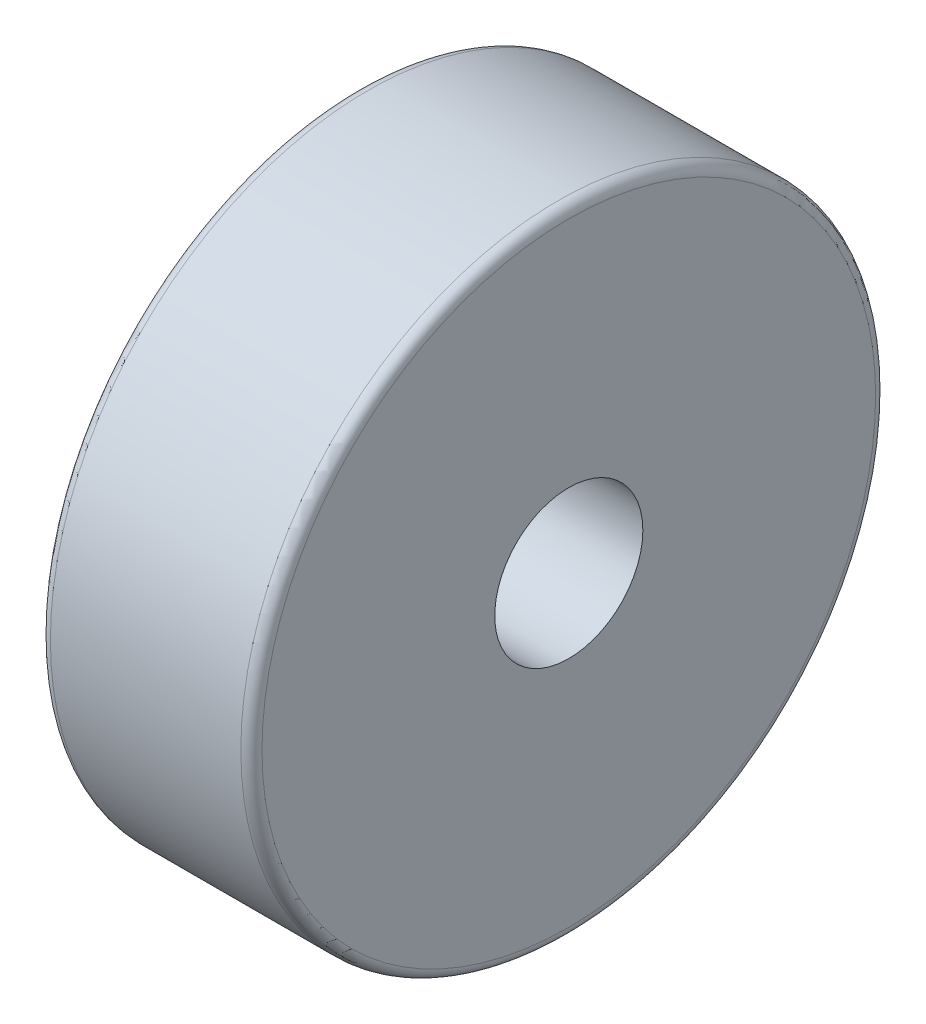
ISO-10303-21;
HEADER;
FILE_DESCRIPTION(('STEP AP214'),'2;1');
FILE_NAME('part.step','',(''),(''),'','','');
FILE_SCHEMA(('AUTOMOTIVE_DESIGN { 1 0 10303 214 1 1 1 1 }'));
ENDSEC;
DATA;
#1=APPLICATION_CONTEXT('core data for automotive mechanical design processes');
#2=APPLICATION_PROTOCOL_DEFINITION('international standard','automotive_design',2000,#1);
#3=PRODUCT_CONTEXT('',#1,'mechanical');
#4=PRODUCT('Part','Part','',(#3));
#5=PRODUCT_RELATED_PRODUCT_CATEGORY('part','',(#4));
#6=PRODUCT_DEFINITION_FORMATION('','',#4);
#7=PRODUCT_DEFINITION_CONTEXT('part definition',#1,'design');
#8=PRODUCT_DEFINITION('design','',#6,#7);
#9=PRODUCT_DEFINITION_SHAPE('','',#8);
#10=(LENGTH_UNIT() NAMED_UNIT(*) SI_UNIT(.MILLI.,.METRE.));
#11=(NAMED_UNIT(*) PLANE_ANGLE_UNIT() SI_UNIT($,.RADIAN.));
#12=(NAMED_UNIT(*) SI_UNIT($,.STERADIAN.) SOLID_ANGLE_UNIT());
#13=UNCERTAINTY_MEASURE_WITH_UNIT(LENGTH_MEASURE(1.E-05),#10,'distance_accuracy_value','');
#14=(GEOMETRIC_REPRESENTATION_CONTEXT(3) GLOBAL_UNCERTAINTY_ASSIGNED_CONTEXT((#13)) GLOBAL_UNIT_ASSIGNED_CONTEXT((#10,
#11,#12)) REPRESENTATION_CONTEXT('',''));
#15=CARTESIAN_POINT('',(0.,0.,0.));
#16=DIRECTION('',(0.,0.,1.));
#17=DIRECTION('',(1.,0.,0.));
#18=AXIS2_PLACEMENT_3D('',#15,#16,#17);
#19=CARTESIAN_POINT('',(0.,0.,0.));
#20=DIRECTION('',(1.,0.,0.));
#21=DIRECTION('',(0.,0.,-1.));
#22=AXIS2_PLACEMENT_3D('',#19,#20,#21);
#23=CYLINDRICAL_SURFACE('',#22,35.);
#24=CARTESIAN_POINT('',(100.,0.,0.));
#25=DIRECTION('',(1.,0.,0.));
#26=DIRECTION('',(0.,0.,-1.));
#27=AXIS2_PLACEMENT_3D('',#24,#25,#26);
#28=CIRCLE('',#27,35.);
#29=CARTESIAN_POINT('',(100.,0.,-35.));
#30=VERTEX_POINT('',#29);
#31=EDGE_CURVE('E140',#30,#30,#28,.T.);
#32=ORIENTED_EDGE('',*,*,#31,.T.);
#33=EDGE_LOOP('',(#32));
#34=FACE_BOUND('',#33,.T.);
#35=CARTESIAN_POINT('',(30.,0.,0.));
#36=DIRECTION('',(-1.,0.,0.));
#37=DIRECTION('',(0.,0.,1.));
#38=AXIS2_PLACEMENT_3D('',#35,#36,#37);
#39=CIRCLE('',#38,35.);
#40=CARTESIAN_POINT('',(30.,0.,35.));
#41=VERTEX_POINT('',#40);
#42=EDGE_CURVE('E11',#41,#41,#39,.T.);
#43=ORIENTED_EDGE('',*,*,#42,.T.);
#44=EDGE_LOOP('',(#43));
#45=FACE_BOUND('',#44,.T.);
#46=ADVANCED_FACE('F36',(#34,#45),#23,.F.);
#47=CARTESIAN_POINT('',(100.,0.,0.));
#48=DIRECTION('',(-1.,0.,0.));
#49=DIRECTION('',(0.,0.,1.));
#50=AXIS2_PLACEMENT_3D('',#47,#48,#49);
#51=CYLINDRICAL_SURFACE('',#50,150.);
#52=CARTESIAN_POINT('',(5.,0.,0.));
#53=DIRECTION('',(1.,0.,0.));
#54=DIRECTION('',(0.,0.,-1.));
#55=AXIS2_PLACEMENT_3D('',#52,#53,#54);
#56=CIRCLE('',#55,150.);
#57=CARTESIAN_POINT('',(5.,0.,150.));
#58=VERTEX_POINT('',#57);
#59=EDGE_CURVE('E171',#58,#58,#56,.T.);
#60=CARTESIAN_POINT('',(95.,0.,0.));
#61=DIRECTION('',(1.,0.,0.));
#62=DIRECTION('',(0.,0.,-1.));
#63=AXIS2_PLACEMENT_3D('',#60,#61,#62);
#64=CIRCLE('',#63,150.);
#65=CARTESIAN_POINT('',(95.,0.,150.));
#66=VERTEX_POINT('',#65);
#67=EDGE_CURVE('E167',#66,#66,#64,.F.);
#68=CARTESIAN_POINT('',(5.,0.,150.));
#69=CARTESIAN_POINT('',(5.9375,0.,150.));
#70=CARTESIAN_POINT('',(6.875,0.,150.));
#71=CARTESIAN_POINT('',(8.75,0.,150.));
#72=CARTESIAN_POINT('',(9.68750000000001,0.,150.));
#73=CARTESIAN_POINT('',(11.5625,0.,150.));
#74=CARTESIAN_POINT('',(12.5,0.,150.));
#75=CARTESIAN_POINT('',(14.375,0.,150.));
#76=CARTESIAN_POINT('',(15.3125,0.,150.));
#77=CARTESIAN_POINT('',(17.1875,0.,150.));
#78=CARTESIAN_POINT('',(18.125,0.,150.));
#79=CARTESIAN_POINT('',(20.,0.,150.));
#80=CARTESIAN_POINT('',(20.9375,0.,150.));
#81=CARTESIAN_POINT('',(22.8125,0.,150.));
#82=CARTESIAN_POINT('',(23.75,0.,150.));
#83=CARTESIAN_POINT('',(25.625,0.,150.));
#84=CARTESIAN_POINT('',(26.5625,0.,150.));
#85=CARTESIAN_POINT('',(28.4375,0.,150.));
#86=CARTESIAN_POINT('',(29.375,0.,150.));
#87=CARTESIAN_POINT('',(31.25,0.,150.));
#88=CARTESIAN_POINT('',(32.1875,0.,150.));
#89=CARTESIAN_POINT('',(34.0625,0.,150.));
#90=CARTESIAN_POINT('',(35.,0.,150.));
#91=CARTESIAN_POINT('',(36.875,0.,150.));
#92=CARTESIAN_POINT('',(37.8125,0.,150.));
#93=CARTESIAN_POINT('',(39.6875,0.,150.));
#94=CARTESIAN_POINT('',(40.625,0.,150.));
#95=CARTESIAN_POINT('',(42.5,0.,150.));
#96=CARTESIAN_POINT('',(43.4375,0.,150.));
#97=CARTESIAN_POINT('',(45.3125,0.,150.));
#98=CARTESIAN_POINT('',(46.25,0.,150.));
#99=CARTESIAN_POINT('',(48.125,0.,150.));
#100=CARTESIAN_POINT('',(49.0625,0.,150.));
#101=CARTESIAN_POINT('',(50.9375,0.,150.));
#102=CARTESIAN_POINT('',(51.875,0.,150.));
#103=CARTESIAN_POINT('',(53.75,0.,150.));
#104=CARTESIAN_POINT('',(54.6875,0.,150.));
#105=CARTESIAN_POINT('',(56.5625,0.,150.));
#106=CARTESIAN_POINT('',(57.5,0.,150.));
#107=CARTESIAN_POINT('',(59.375,0.,150.));
#108=CARTESIAN_POINT('',(60.3125,0.,150.));
#109=CARTESIAN_POINT('',(62.1875,0.,150.));
#110=CARTESIAN_POINT('',(63.125,0.,150.));
#111=CARTESIAN_POINT('',(65.,0.,150.));
#112=CARTESIAN_POINT('',(65.9375,0.,150.));
#113=CARTESIAN_POINT('',(67.8125,0.,150.));
#114=CARTESIAN_POINT('',(68.75,0.,150.));
#115=CARTESIAN_POINT('',(70.625,0.,150.));
#116=CARTESIAN_POINT('',(71.5625,0.,150.));
#117=CARTESIAN_POINT('',(73.4375,0.,150.));
#118=CARTESIAN_POINT('',(74.375,0.,150.));
#119=CARTESIAN_POINT('',(76.25,0.,150.));
#120=CARTESIAN_POINT('',(77.1875,0.,150.));
#121=CARTESIAN_POINT('',(79.0625,0.,150.));
#122=CARTESIAN_POINT('',(80.,0.,150.));
#123=CARTESIAN_POINT('',(81.875,0.,150.));
#124=CARTESIAN_POINT('',(82.8125,0.,150.));
#125=CARTESIAN_POINT('',(84.6875,0.,150.));
#126=CARTESIAN_POINT('',(85.625,0.,150.));
#127=CARTESIAN_POINT('',(87.5,0.,150.));
#128=CARTESIAN_POINT('',(88.4375,0.,150.));
#129=CARTESIAN_POINT('',(90.3125,0.,150.));
#130=CARTESIAN_POINT('',(91.25,0.,150.));
#131=CARTESIAN_POINT('',(93.125,0.,150.));
#132=CARTESIAN_POINT('',(94.0625,0.,150.));
#133=CARTESIAN_POINT('',(95.,0.,150.));
#134=B_SPLINE_CURVE_WITH_KNOTS('',3,(#68,#69,#70,#71,#72,#73,#74,#75,#76,#77,#78,#79,#80,#81,
#82,#83,#84,#85,#86,#87,#88,#89,#90,#91,#92,#93,#94,#95,#96,#97,#98,#99,#100,#101,#102,#103,
#104,#105,#106,#107,#108,#109,#110,#111,#112,#113,#114,#115,#116,#117,#118,#119,#120,#121,#122,
#123,#124,#125,#126,#127,#128,#129,#130,#131,#132,#133),.UNSPECIFIED.,.F.,.F.,(4,2,2,2,2,2,2,2,
2,2,2,2,2,2,2,2,2,2,2,2,2,2,2,2,2,2,2,2,2,2,2,2,4),(0.,2.8125,5.62500000000001,8.4375,11.25,
14.0625,16.875,19.6875,22.5,25.3125,28.125,30.9375,33.75,36.5625,39.375,42.1875,45.,47.8125,
50.625,53.4375,56.25,59.0625,61.875,64.6875,67.5,70.3125,73.125,75.9375,78.75,81.5625,84.375,
87.1875,90.),.UNSPECIFIED.);
#135=EDGE_CURVE('BSEAM196',#58,#66,#134,.T.);
#136=ORIENTED_EDGE('',*,*,#59,.T.);
#137=ORIENTED_EDGE('',*,*,#67,.T.);
#138=ORIENTED_EDGE('',*,*,#135,.T.);
#139=ORIENTED_EDGE('',*,*,#135,.F.);
#140=EDGE_LOOP('',(#136,#138,#137,#139));
#141=FACE_BOUND('',#140,.T.);
#142=ADVANCED_FACE('F196',(#141),#51,.T.);
#143=CARTESIAN_POINT('',(100.,0.,0.));
#144=DIRECTION('',(1.,0.,0.));
#145=DIRECTION('',(0.,0.,-1.));
#146=AXIS2_PLACEMENT_3D('',#143,#144,#145);
#147=PLANE('',#146);
#148=CARTESIAN_POINT('',(100.,0.,0.));
#149=DIRECTION('',(1.,0.,0.));
#150=DIRECTION('',(0.,0.,-1.));
#151=AXIS2_PLACEMENT_3D('',#148,#149,#150);
#152=CIRCLE('',#151,145.);
#153=CARTESIAN_POINT('',(100.,0.,-145.));
#154=VERTEX_POINT('',#153);
#155=EDGE_CURVE('E45',#154,#154,#152,.T.);
#156=ORIENTED_EDGE('',*,*,#155,.T.);
#157=EDGE_LOOP('',(#156));
#158=FACE_BOUND('',#157,.T.);
#159=ORIENTED_EDGE('',*,*,#31,.F.);
#160=EDGE_LOOP('',(#159));
#161=FACE_BOUND('',#160,.T.);
#162=ADVANCED_FACE('F179',(#158,#161),#147,.T.);
#163=CARTESIAN_POINT('',(0.,0.,0.));
#164=DIRECTION('',(1.,0.,0.));
#165=DIRECTION('',(0.,0.,-1.));
#166=AXIS2_PLACEMENT_3D('',#163,#164,#165);
#167=PLANE('',#166);
#168=DIRECTION('',(0.,1.,0.));
#169=VECTOR('',#168,1.);
#170=CARTESIAN_POINT('',(0.,128.452325786651,-20.));
#171=LINE('',#170,#169);
#172=CARTESIAN_POINT('',(0.,45.8257569495584,-20.));
#173=VERTEX_POINT('',#172);
#174=CARTESIAN_POINT('',(0.,128.452325786651,-20.));
#175=VERTEX_POINT('',#174);
#176=EDGE_CURVE('E65',#173,#175,#171,.T.);
#177=ORIENTED_EDGE('',*,*,#176,.F.);
#178=CARTESIAN_POINT('',(0.,0.,0.));
#179=DIRECTION('',(-1.,0.,0.));
#180=DIRECTION('',(0.,0.,1.));
#181=AXIS2_PLACEMENT_3D('',#178,#179,#180);
#182=CIRCLE('',#181,50.);
#183=CARTESIAN_POINT('',(0.,45.8257569495586,19.9999999999995));
#184=VERTEX_POINT('',#183);
#185=EDGE_CURVE('E139',#184,#173,#182,.T.);
#186=ORIENTED_EDGE('',*,*,#185,.F.);
#187=DIRECTION('',(0.,-1.,0.));
#188=VECTOR('',#187,1.);
#189=CARTESIAN_POINT('',(0.,128.452325786651,19.9999999999986));
#190=LINE('',#189,#188);
#191=CARTESIAN_POINT('',(0.,128.452325786651,19.9999999999987));
#192=VERTEX_POINT('',#191);
#193=EDGE_CURVE('E117',#192,#184,#190,.T.);
#194=ORIENTED_EDGE('',*,*,#193,.F.);
#195=CARTESIAN_POINT('',(0.,0.,0.));
#196=DIRECTION('',(-1.,0.,0.));
#197=DIRECTION('',(0.,-1.,0.));
#198=AXIS2_PLACEMENT_3D('',#195,#196,#197);
#199=CIRCLE('',#198,130.);
#200=CARTESIAN_POINT('',(0.,20.0000000000013,128.452325786651));
#201=VERTEX_POINT('',#200);
#202=EDGE_CURVE('E128',#201,#192,#199,.T.);
#203=ORIENTED_EDGE('',*,*,#202,.F.);
#204=DIRECTION('',(0.,0.,1.));
#205=VECTOR('',#204,1.);
#206=CARTESIAN_POINT('',(0.,20.0000000000013,128.452325786651));
#207=LINE('',#206,#205);
#208=CARTESIAN_POINT('',(0.,20.0000000000005,45.8257569495582));
#209=VERTEX_POINT('',#208);
#210=EDGE_CURVE('E133',#209,#201,#207,.T.);
#211=ORIENTED_EDGE('',*,*,#210,.F.);
#212=CARTESIAN_POINT('',(0.,-20.,45.8257569495584));
#213=VERTEX_POINT('',#212);
#214=EDGE_CURVE('E502',#213,#209,#182,.T.);
#215=ORIENTED_EDGE('',*,*,#214,.F.);
#216=DIRECTION('',(0.,0.,-1.));
#217=VECTOR('',#216,1.);
#218=CARTESIAN_POINT('',(0.,-20.,128.452325786651));
#219=LINE('',#218,#217);
#220=CARTESIAN_POINT('',(0.,-20.,128.452325786651));
#221=VERTEX_POINT('',#220);
#222=EDGE_CURVE('E123',#221,#213,#219,.T.);
#223=ORIENTED_EDGE('',*,*,#222,.F.);
#224=CARTESIAN_POINT('',(0.,0.,0.));
#225=DIRECTION('',(-1.,0.,0.));
#226=DIRECTION('',(0.,0.,-1.));
#227=AXIS2_PLACEMENT_3D('',#224,#225,#226);
#228=CIRCLE('',#227,130.);
#229=CARTESIAN_POINT('',(0.,-128.452325786651,20.));
#230=VERTEX_POINT('',#229);
#231=EDGE_CURVE('E449',#230,#221,#228,.T.);
#232=ORIENTED_EDGE('',*,*,#231,.F.);
#233=DIRECTION('',(0.,-1.,0.));
#234=VECTOR('',#233,1.);
#235=CARTESIAN_POINT('',(0.,-128.452325786651,20.));
#236=LINE('',#235,#234);
#237=CARTESIAN_POINT('',(0.,-45.8257569495584,20.));
#238=VERTEX_POINT('',#237);
#239=EDGE_CURVE('E457',#238,#230,#236,.T.);
#240=ORIENTED_EDGE('',*,*,#239,.F.);
#241=CARTESIAN_POINT('',(0.,-45.8257569495585,-19.9999999999998));
#242=VERTEX_POINT('',#241);
#243=EDGE_CURVE('E510',#242,#238,#182,.T.);
#244=ORIENTED_EDGE('',*,*,#243,.F.);
#245=DIRECTION('',(0.,1.,0.));
#246=VECTOR('',#245,1.);
#247=CARTESIAN_POINT('',(0.,-128.452325786651,-19.9999999999995));
#248=LINE('',#247,#246);
#249=CARTESIAN_POINT('',(0.,-128.452325786651,-19.9999999999996));
#250=VERTEX_POINT('',#249);
#251=EDGE_CURVE('E425',#250,#242,#248,.T.);
#252=ORIENTED_EDGE('',*,*,#251,.F.);
#253=CARTESIAN_POINT('',(0.,0.,0.));
#254=DIRECTION('',(-1.,0.,0.));
#255=DIRECTION('',(0.,1.,0.));
#256=AXIS2_PLACEMENT_3D('',#253,#254,#255);
#257=CIRCLE('',#256,130.);
#258=CARTESIAN_POINT('',(0.,-20.0000000000004,-128.452325786651));
#259=VERTEX_POINT('',#258);
#260=EDGE_CURVE('E430',#259,#250,#257,.T.);
#261=ORIENTED_EDGE('',*,*,#260,.F.);
#262=DIRECTION('',(0.,0.,-1.));
#263=VECTOR('',#262,1.);
#264=CARTESIAN_POINT('',(0.,-20.0000000000004,-128.452325786651));
#265=LINE('',#264,#263);
#266=CARTESIAN_POINT('',(0.,-20.0000000000001,-45.8257569495584));
#267=VERTEX_POINT('',#266);
#268=EDGE_CURVE('E433',#267,#259,#265,.T.);
#269=ORIENTED_EDGE('',*,*,#268,.F.);
#270=CARTESIAN_POINT('',(0.,20.,-45.8257569495584));
#271=VERTEX_POINT('',#270);
#272=EDGE_CURVE('E530',#271,#267,#182,.T.);
#273=ORIENTED_EDGE('',*,*,#272,.F.);
#274=DIRECTION('',(0.,0.,1.));
#275=VECTOR('',#274,1.);
#276=CARTESIAN_POINT('',(0.,20.,-128.452325786651));
#277=LINE('',#276,#275);
#278=CARTESIAN_POINT('',(0.,20.,-128.452325786651));
#279=VERTEX_POINT('',#278);
#280=EDGE_CURVE('E161',#279,#271,#277,.T.);
#281=ORIENTED_EDGE('',*,*,#280,.F.);
#282=CARTESIAN_POINT('',(0.,0.,0.));
#283=DIRECTION('',(-1.,0.,0.));
#284=DIRECTION('',(0.,0.,1.));
#285=AXIS2_PLACEMENT_3D('',#282,#283,#284);
#286=CIRCLE('',#285,130.);
#287=EDGE_CURVE('E155',#175,#279,#286,.T.);
#288=ORIENTED_EDGE('',*,*,#287,.F.);
#289=EDGE_LOOP('',(#177,#186,#194,#203,#211,#215,#223,#232,#240,#244,#252,#261,#269,#273,#281,#288));
#290=FACE_BOUND('',#289,.T.);
#291=CARTESIAN_POINT('',(0.,0.,0.));
#292=DIRECTION('',(1.,0.,0.));
#293=DIRECTION('',(0.,0.,-1.));
#294=AXIS2_PLACEMENT_3D('',#291,#292,#293);
#295=CIRCLE('',#294,145.);
#296=CARTESIAN_POINT('',(0.,0.,-145.));
#297=VERTEX_POINT('',#296);
#298=EDGE_CURVE('E174',#297,#297,#295,.F.);
#299=ORIENTED_EDGE('',*,*,#298,.T.);
#300=EDGE_LOOP('',(#299));
#301=FACE_BOUND('',#300,.T.);
#302=ADVANCED_FACE('F136',(#290,#301),#167,.F.);
#303=CARTESIAN_POINT('',(5.,0.,0.));
#304=DIRECTION('',(1.,0.,0.));
#305=DIRECTION('',(0.,0.,-1.));
#306=AXIS2_PLACEMENT_3D('',#303,#304,#305);
#307=TOROIDAL_SURFACE('',#306,145.,5.);
#308=ORIENTED_EDGE('',*,*,#298,.F.);
#309=EDGE_LOOP('',(#308));
#310=FACE_BOUND('',#309,.T.);
#311=ORIENTED_EDGE('',*,*,#59,.F.);
#312=EDGE_LOOP('',(#311));
#313=FACE_BOUND('',#312,.T.);
#314=ADVANCED_FACE('F184',(#310,#313),#307,.T.);
#315=CARTESIAN_POINT('',(95.,0.,0.));
#316=DIRECTION('',(1.,0.,0.));
#317=DIRECTION('',(0.,0.,-1.));
#318=AXIS2_PLACEMENT_3D('',#315,#316,#317);
#319=TOROIDAL_SURFACE('',#318,145.,5.);
#320=ORIENTED_EDGE('',*,*,#67,.F.);
#321=EDGE_LOOP('',(#320));
#322=FACE_BOUND('',#321,.T.);
#323=ORIENTED_EDGE('',*,*,#155,.F.);
#324=EDGE_LOOP('',(#323));
#325=FACE_BOUND('',#324,.T.);
#326=ADVANCED_FACE('F38',(#322,#325),#319,.T.);
#327=CARTESIAN_POINT('',(30.,20.,-128.452325786651));
#328=DIRECTION('',(0.,-1.,0.));
#329=DIRECTION('',(0.,0.,-1.));
#330=AXIS2_PLACEMENT_3D('',#327,#328,#329);
#331=PLANE('',#330);
#332=ORIENTED_EDGE('',*,*,#280,.T.);
#333=DIRECTION('',(-1.,0.,0.));
#334=VECTOR('',#333,1.);
#335=CARTESIAN_POINT('',(171.42135623731,20.,-45.8257569495584));
#336=LINE('',#335,#334);
#337=CARTESIAN_POINT('',(30.,20.,-45.8257569495584));
#338=VERTEX_POINT('',#337);
#339=EDGE_CURVE('E144',#271,#338,#336,.F.);
#340=ORIENTED_EDGE('',*,*,#339,.T.);
#341=DIRECTION('',(0.,0.,1.));
#342=VECTOR('',#341,1.);
#343=CARTESIAN_POINT('',(30.,20.,-128.452325786651));
#344=LINE('',#343,#342);
#345=CARTESIAN_POINT('',(30.,20.,-128.452325786651));
#346=VERTEX_POINT('',#345);
#347=EDGE_CURVE('E151',#346,#338,#344,.T.);
#348=ORIENTED_EDGE('',*,*,#347,.F.);
#349=DIRECTION('',(-1.,0.,0.));
#350=VECTOR('',#349,1.);
#351=CARTESIAN_POINT('',(30.,20.,-128.452325786651));
#352=LINE('',#351,#350);
#353=EDGE_CURVE('E53',#346,#279,#352,.T.);
#354=ORIENTED_EDGE('',*,*,#353,.T.);
#355=EDGE_LOOP('',(#332,#340,#348,#354));
#356=FACE_BOUND('',#355,.T.);
#357=ADVANCED_FACE('F183',(#356),#331,.F.);
#358=CARTESIAN_POINT('',(30.,0.,0.));
#359=DIRECTION('',(-1.,0.,0.));
#360=DIRECTION('',(0.,0.,1.));
#361=AXIS2_PLACEMENT_3D('',#358,#359,#360);
#362=CYLINDRICAL_SURFACE('',#361,130.);
#363=ORIENTED_EDGE('',*,*,#287,.T.);
#364=ORIENTED_EDGE('',*,*,#353,.F.);
#365=CARTESIAN_POINT('',(30.,0.,0.));
#366=DIRECTION('',(-1.,0.,0.));
#367=DIRECTION('',(0.,0.,1.));
#368=AXIS2_PLACEMENT_3D('',#365,#366,#367);
#369=CIRCLE('',#368,130.);
#370=CARTESIAN_POINT('',(30.,128.452325786651,-20.));
#371=VERTEX_POINT('',#370);
#372=EDGE_CURVE('E157',#371,#346,#369,.T.);
#373=ORIENTED_EDGE('',*,*,#372,.F.);
#374=DIRECTION('',(-1.,0.,0.));
#375=VECTOR('',#374,1.);
#376=CARTESIAN_POINT('',(30.,128.452325786651,-20.));
#377=LINE('',#376,#375);
#378=EDGE_CURVE('E160',#371,#175,#377,.T.);
#379=ORIENTED_EDGE('',*,*,#378,.T.);
#380=EDGE_LOOP('',(#363,#364,#373,#379));
#381=FACE_BOUND('',#380,.T.);
#382=ADVANCED_FACE('F190',(#381),#362,.F.);
#383=CARTESIAN_POINT('',(30.,128.452325786651,-20.));
#384=DIRECTION('',(0.,0.,1.));
#385=DIRECTION('',(1.,0.,0.));
#386=AXIS2_PLACEMENT_3D('',#383,#384,#385);
#387=PLANE('',#386);
#388=DIRECTION('',(0.,1.,0.));
#389=VECTOR('',#388,1.);
#390=CARTESIAN_POINT('',(30.,128.452325786651,-20.));
#391=LINE('',#390,#389);
#392=CARTESIAN_POINT('',(30.,45.8257569495584,-20.));
#393=VERTEX_POINT('',#392);
#394=EDGE_CURVE('E154',#393,#371,#391,.T.);
#395=ORIENTED_EDGE('',*,*,#394,.F.);
#396=DIRECTION('',(-1.,0.,0.));
#397=VECTOR('',#396,1.);
#398=CARTESIAN_POINT('',(171.42135623731,45.8257569495584,-20.));
#399=LINE('',#398,#397);
#400=EDGE_CURVE('E521',#393,#173,#399,.T.);
#401=ORIENTED_EDGE('',*,*,#400,.T.);
#402=ORIENTED_EDGE('',*,*,#176,.T.);
#403=ORIENTED_EDGE('',*,*,#378,.F.);
#404=EDGE_LOOP('',(#395,#401,#402,#403));
#405=FACE_BOUND('',#404,.T.);
#406=ADVANCED_FACE('F243',(#405),#387,.F.);
#407=CARTESIAN_POINT('',(30.,0.,0.));
#408=DIRECTION('',(-1.,0.,0.));
#409=DIRECTION('',(0.,0.,1.));
#410=AXIS2_PLACEMENT_3D('',#407,#408,#409);
#411=PLANE('',#410);
#412=ORIENTED_EDGE('',*,*,#347,.T.);
#413=CARTESIAN_POINT('',(30.,0.,0.));
#414=DIRECTION('',(-1.,0.,0.));
#415=DIRECTION('',(0.,0.,1.));
#416=AXIS2_PLACEMENT_3D('',#413,#414,#415);
#417=CIRCLE('',#416,50.);
#418=CARTESIAN_POINT('',(30.,-20.0000000000001,-45.8257569495584));
#419=VERTEX_POINT('',#418);
#420=EDGE_CURVE('E418',#419,#338,#417,.F.);
#421=ORIENTED_EDGE('',*,*,#420,.F.);
#422=DIRECTION('',(0.,0.,-1.));
#423=VECTOR('',#422,1.);
#424=CARTESIAN_POINT('',(30.,-20.0000000000004,-128.452325786651));
#425=LINE('',#424,#423);
#426=CARTESIAN_POINT('',(30.,-20.0000000000004,-128.452325786651));
#427=VERTEX_POINT('',#426);
#428=EDGE_CURVE('E429',#419,#427,#425,.T.);
#429=ORIENTED_EDGE('',*,*,#428,.T.);
#430=CARTESIAN_POINT('',(30.,0.,0.));
#431=DIRECTION('',(-1.,0.,0.));
#432=DIRECTION('',(0.,1.,0.));
#433=AXIS2_PLACEMENT_3D('',#430,#431,#432);
#434=CIRCLE('',#433,130.);
#435=CARTESIAN_POINT('',(30.,-128.452325786651,-19.9999999999996));
#436=VERTEX_POINT('',#435);
#437=EDGE_CURVE('E428',#427,#436,#434,.T.);
#438=ORIENTED_EDGE('',*,*,#437,.T.);
#439=DIRECTION('',(0.,1.,0.));
#440=VECTOR('',#439,1.);
#441=CARTESIAN_POINT('',(30.,-128.452325786651,-19.9999999999995));
#442=LINE('',#441,#440);
#443=CARTESIAN_POINT('',(30.,-45.8257569495585,-19.9999999999998));
#444=VERTEX_POINT('',#443);
#445=EDGE_CURVE('E422',#436,#444,#442,.T.);
#446=ORIENTED_EDGE('',*,*,#445,.T.);
#447=CARTESIAN_POINT('',(30.,-45.8257569495584,20.));
#448=VERTEX_POINT('',#447);
#449=EDGE_CURVE('E404',#448,#444,#417,.F.);
#450=ORIENTED_EDGE('',*,*,#449,.F.);
#451=DIRECTION('',(0.,-1.,0.));
#452=VECTOR('',#451,1.);
#453=CARTESIAN_POINT('',(30.,-128.452325786651,20.));
#454=LINE('',#453,#452);
#455=CARTESIAN_POINT('',(30.,-128.452325786651,20.));
#456=VERTEX_POINT('',#455);
#457=EDGE_CURVE('E448',#448,#456,#454,.T.);
#458=ORIENTED_EDGE('',*,*,#457,.T.);
#459=CARTESIAN_POINT('',(30.,0.,0.));
#460=DIRECTION('',(-1.,0.,0.));
#461=DIRECTION('',(0.,0.,-1.));
#462=AXIS2_PLACEMENT_3D('',#459,#460,#461);
#463=CIRCLE('',#462,130.);
#464=CARTESIAN_POINT('',(30.,-20.,128.452325786651));
#465=VERTEX_POINT('',#464);
#466=EDGE_CURVE('E451',#456,#465,#463,.T.);
#467=ORIENTED_EDGE('',*,*,#466,.T.);
#468=DIRECTION('',(0.,0.,-1.));
#469=VECTOR('',#468,1.);
#470=CARTESIAN_POINT('',(30.,-20.,128.452325786651));
#471=LINE('',#470,#469);
#472=CARTESIAN_POINT('',(30.,-20.,45.8257569495584));
#473=VERTEX_POINT('',#472);
#474=EDGE_CURVE('E445',#465,#473,#471,.T.);
#475=ORIENTED_EDGE('',*,*,#474,.T.);
#476=CARTESIAN_POINT('',(30.,20.0000000000005,45.8257569495582));
#477=VERTEX_POINT('',#476);
#478=EDGE_CURVE('E420',#477,#473,#417,.F.);
#479=ORIENTED_EDGE('',*,*,#478,.F.);
#480=DIRECTION('',(0.,0.,1.));
#481=VECTOR('',#480,1.);
#482=CARTESIAN_POINT('',(30.,20.0000000000013,128.452325786651));
#483=LINE('',#482,#481);
#484=CARTESIAN_POINT('',(30.,20.0000000000013,128.452325786651));
#485=VERTEX_POINT('',#484);
#486=EDGE_CURVE('E464',#477,#485,#483,.T.);
#487=ORIENTED_EDGE('',*,*,#486,.T.);
#488=CARTESIAN_POINT('',(30.,0.,0.));
#489=DIRECTION('',(-1.,0.,0.));
#490=DIRECTION('',(0.,-1.,0.));
#491=AXIS2_PLACEMENT_3D('',#488,#489,#490);
#492=CIRCLE('',#491,130.);
#493=CARTESIAN_POINT('',(30.,128.452325786651,19.9999999999987));
#494=VERTEX_POINT('',#493);
#495=EDGE_CURVE('E147',#485,#494,#492,.T.);
#496=ORIENTED_EDGE('',*,*,#495,.T.);
#497=DIRECTION('',(0.,-1.,0.));
#498=VECTOR('',#497,1.);
#499=CARTESIAN_POINT('',(30.,128.452325786651,19.9999999999986));
#500=LINE('',#499,#498);
#501=CARTESIAN_POINT('',(30.,45.8257569495586,19.9999999999995));
#502=VERTEX_POINT('',#501);
#503=EDGE_CURVE('E119',#494,#502,#500,.T.);
#504=ORIENTED_EDGE('',*,*,#503,.T.);
#505=EDGE_CURVE('E471',#393,#502,#417,.F.);
#506=ORIENTED_EDGE('',*,*,#505,.F.);
#507=ORIENTED_EDGE('',*,*,#394,.T.);
#508=ORIENTED_EDGE('',*,*,#372,.T.);
#509=EDGE_LOOP('',(#412,#421,#429,#438,#446,#450,#458,#467,#475,#479,#487,#496,#504,#506,#507,#508));
#510=FACE_BOUND('',#509,.T.);
#511=ORIENTED_EDGE('',*,*,#42,.F.);
#512=EDGE_LOOP('',(#511));
#513=FACE_BOUND('',#512,.T.);
#514=ADVANCED_FACE('F240',(#510,#513),#411,.T.);
#515=CARTESIAN_POINT('',(30.,128.452325786651,19.9999999999986));
#516=DIRECTION('',(0.,0.,-1.));
#517=DIRECTION('',(0.,1.,0.));
#518=AXIS2_PLACEMENT_3D('',#515,#516,#517);
#519=PLANE('',#518);
#520=ORIENTED_EDGE('',*,*,#193,.T.);
#521=DIRECTION('',(-1.,0.,0.));
#522=VECTOR('',#521,1.);
#523=CARTESIAN_POINT('',(171.42135623731,45.8257569495586,19.9999999999995));
#524=LINE('',#523,#522);
#525=EDGE_CURVE('E519',#184,#502,#524,.F.);
#526=ORIENTED_EDGE('',*,*,#525,.T.);
#527=ORIENTED_EDGE('',*,*,#503,.F.);
#528=DIRECTION('',(-1.,0.,0.));
#529=VECTOR('',#528,1.);
#530=CARTESIAN_POINT('',(30.,128.452325786651,19.9999999999987));
#531=LINE('',#530,#529);
#532=EDGE_CURVE('E111',#494,#192,#531,.T.);
#533=ORIENTED_EDGE('',*,*,#532,.T.);
#534=EDGE_LOOP('',(#520,#526,#527,#533));
#535=FACE_BOUND('',#534,.T.);
#536=ADVANCED_FACE('F113',(#535),#519,.F.);
#537=CARTESIAN_POINT('',(30.,0.,0.));
#538=DIRECTION('',(-1.,0.,0.));
#539=DIRECTION('',(0.,0.,1.));
#540=AXIS2_PLACEMENT_3D('',#537,#538,#539);
#541=CYLINDRICAL_SURFACE('',#540,130.);
#542=ORIENTED_EDGE('',*,*,#202,.T.);
#543=ORIENTED_EDGE('',*,*,#532,.F.);
#544=ORIENTED_EDGE('',*,*,#495,.F.);
#545=DIRECTION('',(-1.,0.,0.));
#546=VECTOR('',#545,1.);
#547=CARTESIAN_POINT('',(30.,20.0000000000013,128.452325786651));
#548=LINE('',#547,#546);
#549=EDGE_CURVE('E124',#485,#201,#548,.T.);
#550=ORIENTED_EDGE('',*,*,#549,.T.);
#551=EDGE_LOOP('',(#542,#543,#544,#550));
#552=FACE_BOUND('',#551,.T.);
#553=ADVANCED_FACE('F129',(#552),#541,.F.);
#554=CARTESIAN_POINT('',(30.,20.0000000000013,128.452325786651));
#555=DIRECTION('',(0.,-1.,0.));
#556=DIRECTION('',(0.,0.,-1.));
#557=AXIS2_PLACEMENT_3D('',#554,#555,#556);
#558=PLANE('',#557);
#559=ORIENTED_EDGE('',*,*,#486,.F.);
#560=DIRECTION('',(-1.,0.,0.));
#561=VECTOR('',#560,1.);
#562=CARTESIAN_POINT('',(171.42135623731,20.0000000000005,45.8257569495582));
#563=LINE('',#562,#561);
#564=EDGE_CURVE('E506',#477,#209,#563,.T.);
#565=ORIENTED_EDGE('',*,*,#564,.T.);
#566=ORIENTED_EDGE('',*,*,#210,.T.);
#567=ORIENTED_EDGE('',*,*,#549,.F.);
#568=EDGE_LOOP('',(#559,#565,#566,#567));
#569=FACE_BOUND('',#568,.T.);
#570=ADVANCED_FACE('F231',(#569),#558,.F.);
#571=CARTESIAN_POINT('',(30.,-20.,128.452325786651));
#572=DIRECTION('',(0.,1.,0.));
#573=DIRECTION('',(0.,0.,1.));
#574=AXIS2_PLACEMENT_3D('',#571,#572,#573);
#575=PLANE('',#574);
#576=ORIENTED_EDGE('',*,*,#222,.T.);
#577=DIRECTION('',(-1.,0.,0.));
#578=VECTOR('',#577,1.);
#579=CARTESIAN_POINT('',(171.42135623731,-20.,45.8257569495584));
#580=LINE('',#579,#578);
#581=EDGE_CURVE('E500',#213,#473,#580,.F.);
#582=ORIENTED_EDGE('',*,*,#581,.T.);
#583=ORIENTED_EDGE('',*,*,#474,.F.);
#584=DIRECTION('',(-1.,0.,0.));
#585=VECTOR('',#584,1.);
#586=CARTESIAN_POINT('',(30.,-20.,128.452325786651));
#587=LINE('',#586,#585);
#588=EDGE_CURVE('E440',#465,#221,#587,.T.);
#589=ORIENTED_EDGE('',*,*,#588,.T.);
#590=EDGE_LOOP('',(#576,#582,#583,#589));
#591=FACE_BOUND('',#590,.T.);
#592=ADVANCED_FACE('F224',(#591),#575,.F.);
#593=CARTESIAN_POINT('',(30.,0.,0.));
#594=DIRECTION('',(-1.,0.,0.));
#595=DIRECTION('',(0.,0.,1.));
#596=AXIS2_PLACEMENT_3D('',#593,#594,#595);
#597=CYLINDRICAL_SURFACE('',#596,130.);
#598=ORIENTED_EDGE('',*,*,#231,.T.);
#599=ORIENTED_EDGE('',*,*,#588,.F.);
#600=ORIENTED_EDGE('',*,*,#466,.F.);
#601=DIRECTION('',(-1.,0.,0.));
#602=VECTOR('',#601,1.);
#603=CARTESIAN_POINT('',(30.,-128.452325786651,20.));
#604=LINE('',#603,#602);
#605=EDGE_CURVE('E454',#456,#230,#604,.T.);
#606=ORIENTED_EDGE('',*,*,#605,.T.);
#607=EDGE_LOOP('',(#598,#599,#600,#606));
#608=FACE_BOUND('',#607,.T.);
#609=ADVANCED_FACE('F221',(#608),#597,.F.);
#610=CARTESIAN_POINT('',(30.,-128.452325786651,20.));
#611=DIRECTION('',(0.,0.,-1.));
#612=DIRECTION('',(-1.,0.,0.));
#613=AXIS2_PLACEMENT_3D('',#610,#611,#612);
#614=PLANE('',#613);
#615=ORIENTED_EDGE('',*,*,#457,.F.);
#616=DIRECTION('',(-1.,0.,0.));
#617=VECTOR('',#616,1.);
#618=CARTESIAN_POINT('',(171.42135623731,-45.8257569495584,20.));
#619=LINE('',#618,#617);
#620=EDGE_CURVE('E412',#448,#238,#619,.T.);
#621=ORIENTED_EDGE('',*,*,#620,.T.);
#622=ORIENTED_EDGE('',*,*,#239,.T.);
#623=ORIENTED_EDGE('',*,*,#605,.F.);
#624=EDGE_LOOP('',(#615,#621,#622,#623));
#625=FACE_BOUND('',#624,.T.);
#626=ADVANCED_FACE('F219',(#625),#614,.F.);
#627=CARTESIAN_POINT('',(30.,-128.452325786651,-19.9999999999995));
#628=DIRECTION('',(0.,0.,1.));
#629=DIRECTION('',(0.,-1.,0.));
#630=AXIS2_PLACEMENT_3D('',#627,#628,#629);
#631=PLANE('',#630);
#632=ORIENTED_EDGE('',*,*,#251,.T.);
#633=DIRECTION('',(-1.,0.,0.));
#634=VECTOR('',#633,1.);
#635=CARTESIAN_POINT('',(171.42135623731,-45.8257569495585,-19.9999999999998));
#636=LINE('',#635,#634);
#637=EDGE_CURVE('E408',#242,#444,#636,.F.);
#638=ORIENTED_EDGE('',*,*,#637,.T.);
#639=ORIENTED_EDGE('',*,*,#445,.F.);
#640=DIRECTION('',(-1.,0.,0.));
#641=VECTOR('',#640,1.);
#642=CARTESIAN_POINT('',(30.,-128.452325786651,-19.9999999999996));
#643=LINE('',#642,#641);
#644=EDGE_CURVE('E74',#436,#250,#643,.T.);
#645=ORIENTED_EDGE('',*,*,#644,.T.);
#646=EDGE_LOOP('',(#632,#638,#639,#645));
#647=FACE_BOUND('',#646,.T.);
#648=ADVANCED_FACE('F212',(#647),#631,.F.);
#649=CARTESIAN_POINT('',(30.,0.,0.));
#650=DIRECTION('',(-1.,0.,0.));
#651=DIRECTION('',(0.,0.,1.));
#652=AXIS2_PLACEMENT_3D('',#649,#650,#651);
#653=CYLINDRICAL_SURFACE('',#652,130.);
#654=ORIENTED_EDGE('',*,*,#260,.T.);
#655=ORIENTED_EDGE('',*,*,#644,.F.);
#656=ORIENTED_EDGE('',*,*,#437,.F.);
#657=DIRECTION('',(-1.,0.,0.));
#658=VECTOR('',#657,1.);
#659=CARTESIAN_POINT('',(30.,-20.0000000000004,-128.452325786651));
#660=LINE('',#659,#658);
#661=EDGE_CURVE('E438',#427,#259,#660,.T.);
#662=ORIENTED_EDGE('',*,*,#661,.T.);
#663=EDGE_LOOP('',(#654,#655,#656,#662));
#664=FACE_BOUND('',#663,.T.);
#665=ADVANCED_FACE('F208',(#664),#653,.F.);
#666=CARTESIAN_POINT('',(30.,-20.0000000000004,-128.452325786651));
#667=DIRECTION('',(0.,1.,0.));
#668=DIRECTION('',(0.,0.,1.));
#669=AXIS2_PLACEMENT_3D('',#666,#667,#668);
#670=PLANE('',#669);
#671=ORIENTED_EDGE('',*,*,#428,.F.);
#672=DIRECTION('',(-1.,0.,0.));
#673=VECTOR('',#672,1.);
#674=CARTESIAN_POINT('',(171.42135623731,-20.0000000000001,-45.8257569495584));
#675=LINE('',#674,#673);
#676=EDGE_CURVE('E417',#419,#267,#675,.T.);
#677=ORIENTED_EDGE('',*,*,#676,.T.);
#678=ORIENTED_EDGE('',*,*,#268,.T.);
#679=ORIENTED_EDGE('',*,*,#661,.F.);
#680=EDGE_LOOP('',(#671,#677,#678,#679));
#681=FACE_BOUND('',#680,.T.);
#682=ADVANCED_FACE('F211',(#681),#670,.F.);
#683=CARTESIAN_POINT('',(171.42135623731,0.,0.));
#684=DIRECTION('',(-1.,0.,0.));
#685=DIRECTION('',(0.,0.,1.));
#686=AXIS2_PLACEMENT_3D('',#683,#684,#685);
#687=CYLINDRICAL_SURFACE('',#686,50.);
#688=ORIENTED_EDGE('',*,*,#478,.T.);
#689=ORIENTED_EDGE('',*,*,#581,.F.);
#690=ORIENTED_EDGE('',*,*,#214,.T.);
#691=ORIENTED_EDGE('',*,*,#564,.F.);
#692=EDGE_LOOP('',(#688,#689,#690,#691));
#693=FACE_BOUND('',#692,.T.);
#694=ADVANCED_FACE('F215',(#693),#687,.F.);
#695=ORIENTED_EDGE('',*,*,#505,.T.);
#696=ORIENTED_EDGE('',*,*,#525,.F.);
#697=ORIENTED_EDGE('',*,*,#185,.T.);
#698=ORIENTED_EDGE('',*,*,#400,.F.);
#699=EDGE_LOOP('',(#695,#696,#697,#698));
#700=FACE_BOUND('',#699,.T.);
#701=ADVANCED_FACE('F336',(#700),#687,.F.);
#702=ORIENTED_EDGE('',*,*,#272,.T.);
#703=ORIENTED_EDGE('',*,*,#676,.F.);
#704=ORIENTED_EDGE('',*,*,#420,.T.);
#705=ORIENTED_EDGE('',*,*,#339,.F.);
#706=EDGE_LOOP('',(#702,#703,#704,#705));
#707=FACE_BOUND('',#706,.T.);
#708=ADVANCED_FACE('F207',(#707),#687,.F.);
#709=ORIENTED_EDGE('',*,*,#449,.T.);
#710=ORIENTED_EDGE('',*,*,#637,.F.);
#711=ORIENTED_EDGE('',*,*,#243,.T.);
#712=ORIENTED_EDGE('',*,*,#620,.F.);
#713=EDGE_LOOP('',(#709,#710,#711,#712));
#714=FACE_BOUND('',#713,.T.);
#715=ADVANCED_FACE('F338',(#714),#687,.F.);
#716=CLOSED_SHELL('',(#46,#142,#162,#302,#314,#326,#357,#382,#406,#514,#536,#553,#570,#592,#609,
#626,#648,#665,#682,#694,#701,#708,#715));
#717=MANIFOLD_SOLID_BREP('B2',#716);
#718=ADVANCED_BREP_SHAPE_REPRESENTATION('',(#18,#717),#14);
#719=SHAPE_DEFINITION_REPRESENTATION(#9,#718);
ENDSEC;
END-ISO-10303-21;
